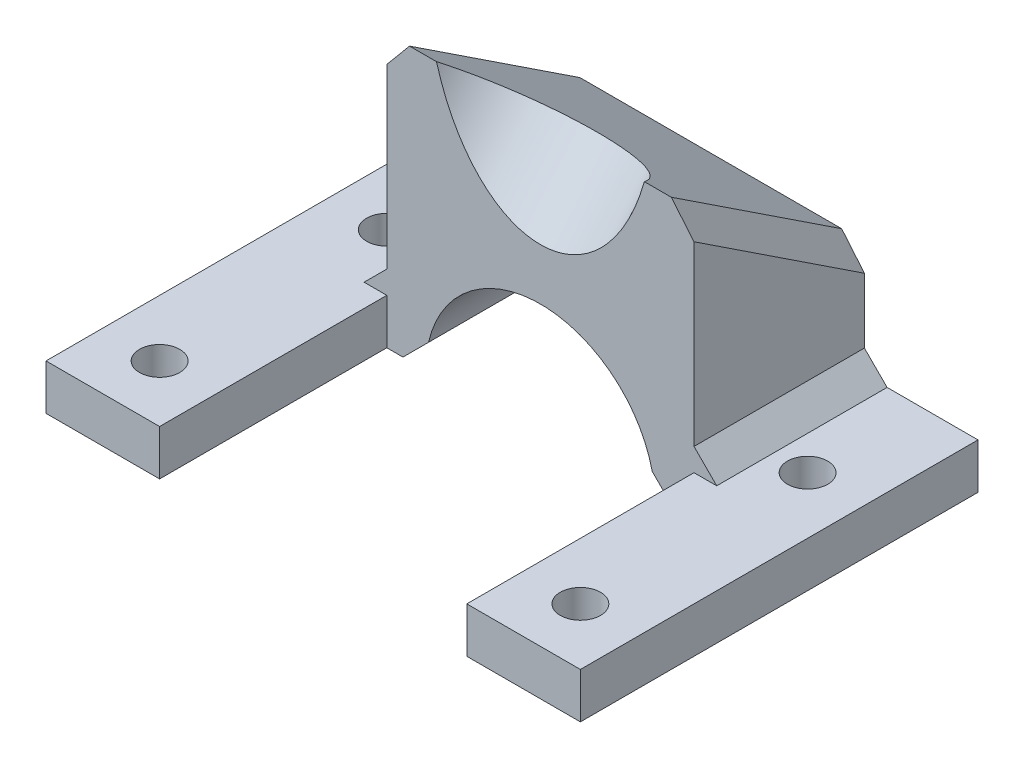
ISO-10303-21;
HEADER;
FILE_DESCRIPTION(('STEP AP214'),'2;1');
FILE_NAME('part.step','',(''),(''),'','','');
FILE_SCHEMA(('AUTOMOTIVE_DESIGN { 1 0 10303 214 1 1 1 1 }'));
ENDSEC;
DATA;
#1=APPLICATION_CONTEXT('core data for automotive mechanical design processes');
#2=APPLICATION_PROTOCOL_DEFINITION('international standard','automotive_design',2000,#1);
#3=PRODUCT_CONTEXT('',#1,'mechanical');
#4=PRODUCT('Part','Part','',(#3));
#5=PRODUCT_RELATED_PRODUCT_CATEGORY('part','',(#4));
#6=PRODUCT_DEFINITION_FORMATION('','',#4);
#7=PRODUCT_DEFINITION_CONTEXT('part definition',#1,'design');
#8=PRODUCT_DEFINITION('design','',#6,#7);
#9=PRODUCT_DEFINITION_SHAPE('','',#8);
#10=(LENGTH_UNIT() NAMED_UNIT(*) SI_UNIT(.MILLI.,.METRE.));
#11=(NAMED_UNIT(*) PLANE_ANGLE_UNIT() SI_UNIT($,.RADIAN.));
#12=(NAMED_UNIT(*) SI_UNIT($,.STERADIAN.) SOLID_ANGLE_UNIT());
#13=UNCERTAINTY_MEASURE_WITH_UNIT(LENGTH_MEASURE(1.E-05),#10,'distance_accuracy_value','');
#14=(GEOMETRIC_REPRESENTATION_CONTEXT(3) GLOBAL_UNCERTAINTY_ASSIGNED_CONTEXT((#13)) GLOBAL_UNIT_ASSIGNED_CONTEXT((#10,
#11,#12)) REPRESENTATION_CONTEXT('',''));
#15=CARTESIAN_POINT('',(0.,0.,0.));
#16=DIRECTION('',(0.,0.,1.));
#17=DIRECTION('',(1.,0.,0.));
#18=AXIS2_PLACEMENT_3D('',#15,#16,#17);
#19=CARTESIAN_POINT('',(0.,0.,50.8));
#20=DIRECTION('',(0.,1.,0.));
#21=DIRECTION('',(0.,0.,1.));
#22=AXIS2_PLACEMENT_3D('',#19,#20,#21);
#23=PLANE('',#22);
#24=CARTESIAN_POINT('',(6.35,0.,12.7));
#25=DIRECTION('',(0.,1.,0.));
#26=DIRECTION('',(0.,0.,1.));
#27=AXIS2_PLACEMENT_3D('',#24,#25,#26);
#28=CIRCLE('',#27,2.25);
#29=CARTESIAN_POINT('',(6.35,0.,14.95));
#30=VERTEX_POINT('',#29);
#31=EDGE_CURVE('E351',#30,#30,#28,.T.);
#32=ORIENTED_EDGE('',*,*,#31,.T.);
#33=EDGE_LOOP('',(#32));
#34=FACE_BOUND('',#33,.T.);
#35=CARTESIAN_POINT('',(6.35,0.,38.1));
#36=DIRECTION('',(0.,1.,0.));
#37=DIRECTION('',(0.,0.,1.));
#38=AXIS2_PLACEMENT_3D('',#35,#36,#37);
#39=CIRCLE('',#38,2.25);
#40=CARTESIAN_POINT('',(6.35,0.,40.35));
#41=VERTEX_POINT('',#40);
#42=EDGE_CURVE('E372',#41,#41,#39,.F.);
#43=ORIENTED_EDGE('',*,*,#42,.F.);
#44=EDGE_LOOP('',(#43));
#45=FACE_BOUND('',#44,.T.);
#46=DIRECTION('',(1.,0.,0.));
#47=VECTOR('',#46,1.);
#48=CARTESIAN_POINT('',(0.,0.,0.));
#49=LINE('',#48,#47);
#50=CARTESIAN_POINT('',(0.,0.,0.));
#51=VERTEX_POINT('',#50);
#52=CARTESIAN_POINT('',(14.5043205374543,0.,0.));
#53=VERTEX_POINT('',#52);
#54=EDGE_CURVE('E350',#51,#53,#49,.T.);
#55=ORIENTED_EDGE('',*,*,#54,.T.);
#56=DIRECTION('',(0.,0.,1.));
#57=VECTOR('',#56,1.);
#58=CARTESIAN_POINT('',(14.5043205374543,0.,19.05));
#59=LINE('',#58,#57);
#60=CARTESIAN_POINT('',(14.5043205374543,0.,19.05));
#61=VERTEX_POINT('',#60);
#62=EDGE_CURVE('E494',#53,#61,#59,.T.);
#63=ORIENTED_EDGE('',*,*,#62,.T.);
#64=DIRECTION('',(1.,0.,0.));
#65=VECTOR('',#64,1.);
#66=CARTESIAN_POINT('',(0.,0.,19.05));
#67=LINE('',#66,#65);
#68=CARTESIAN_POINT('',(12.7,0.,19.05));
#69=VERTEX_POINT('',#68);
#70=EDGE_CURVE('E437',#69,#61,#67,.T.);
#71=ORIENTED_EDGE('',*,*,#70,.F.);
#72=DIRECTION('',(0.,0.,-1.));
#73=VECTOR('',#72,1.);
#74=CARTESIAN_POINT('',(12.7,0.,0.));
#75=LINE('',#74,#73);
#76=CARTESIAN_POINT('',(12.7,0.,44.45));
#77=VERTEX_POINT('',#76);
#78=EDGE_CURVE('E391',#77,#69,#75,.T.);
#79=ORIENTED_EDGE('',*,*,#78,.F.);
#80=DIRECTION('',(1.,0.,0.));
#81=VECTOR('',#80,1.);
#82=CARTESIAN_POINT('',(0.,0.,44.45));
#83=LINE('',#82,#81);
#84=CARTESIAN_POINT('',(0.,0.,44.45));
#85=VERTEX_POINT('',#84);
#86=EDGE_CURVE('E319',#85,#77,#83,.T.);
#87=ORIENTED_EDGE('',*,*,#86,.F.);
#88=DIRECTION('',(0.,0.,-1.));
#89=VECTOR('',#88,1.);
#90=CARTESIAN_POINT('',(0.,0.,50.8));
#91=LINE('',#90,#89);
#92=EDGE_CURVE('E347',#85,#51,#91,.T.);
#93=ORIENTED_EDGE('',*,*,#92,.T.);
#94=EDGE_LOOP('',(#55,#63,#71,#79,#87,#93));
#95=FACE_BOUND('',#94,.T.);
#96=ADVANCED_FACE('F142',(#34,#45,#95),#23,.F.);
#97=CARTESIAN_POINT('',(0.,0.,50.8));
#98=DIRECTION('',(0.,-1.,0.));
#99=DIRECTION('',(0.,0.,-1.));
#100=AXIS2_PLACEMENT_3D('',#97,#98,#99);
#101=PLANE('',#100);
#102=CARTESIAN_POINT('',(53.3926410749086,0.,12.7));
#103=DIRECTION('',(0.,1.,0.));
#104=DIRECTION('',(0.,0.,1.));
#105=AXIS2_PLACEMENT_3D('',#102,#103,#104);
#106=CIRCLE('',#105,2.25);
#107=CARTESIAN_POINT('',(53.3926410749086,0.,14.95));
#108=VERTEX_POINT('',#107);
#109=EDGE_CURVE('E392',#108,#108,#106,.F.);
#110=ORIENTED_EDGE('',*,*,#109,.F.);
#111=EDGE_LOOP('',(#110));
#112=FACE_BOUND('',#111,.T.);
#113=CARTESIAN_POINT('',(53.3926410749086,0.,38.1));
#114=DIRECTION('',(0.,1.,0.));
#115=DIRECTION('',(0.,0.,1.));
#116=AXIS2_PLACEMENT_3D('',#113,#114,#115);
#117=CIRCLE('',#116,2.25);
#118=CARTESIAN_POINT('',(53.3926410749086,0.,40.35));
#119=VERTEX_POINT('',#118);
#120=EDGE_CURVE('E379',#119,#119,#117,.T.);
#121=ORIENTED_EDGE('',*,*,#120,.T.);
#122=EDGE_LOOP('',(#121));
#123=FACE_BOUND('',#122,.T.);
#124=CARTESIAN_POINT('',(45.2383205374543,0.,19.05));
#125=VERTEX_POINT('',#124);
#126=CARTESIAN_POINT('',(47.0426410749086,0.,19.05));
#127=VERTEX_POINT('',#126);
#128=EDGE_CURVE('E431',#125,#127,#67,.T.);
#129=ORIENTED_EDGE('',*,*,#128,.F.);
#130=DIRECTION('',(0.,0.,-1.));
#131=VECTOR('',#130,1.);
#132=CARTESIAN_POINT('',(45.2383205374543,0.,50.8));
#133=LINE('',#132,#131);
#134=CARTESIAN_POINT('',(45.2383205374543,0.,0.));
#135=VERTEX_POINT('',#134);
#136=EDGE_CURVE('E459',#125,#135,#133,.T.);
#137=ORIENTED_EDGE('',*,*,#136,.T.);
#138=DIRECTION('',(-1.,0.,0.));
#139=VECTOR('',#138,1.);
#140=CARTESIAN_POINT('',(0.,0.,0.));
#141=LINE('',#140,#139);
#142=CARTESIAN_POINT('',(59.7426410749086,0.,0.));
#143=VERTEX_POINT('',#142);
#144=EDGE_CURVE('E368',#143,#135,#141,.T.);
#145=ORIENTED_EDGE('',*,*,#144,.F.);
#146=DIRECTION('',(0.,0.,-1.));
#147=VECTOR('',#146,1.);
#148=CARTESIAN_POINT('',(59.7426410749086,0.,50.8));
#149=LINE('',#148,#147);
#150=CARTESIAN_POINT('',(59.7426410749086,0.,44.45));
#151=VERTEX_POINT('',#150);
#152=EDGE_CURVE('E322',#151,#143,#149,.T.);
#153=ORIENTED_EDGE('',*,*,#152,.F.);
#154=DIRECTION('',(1.,0.,0.));
#155=VECTOR('',#154,1.);
#156=CARTESIAN_POINT('',(0.,0.,44.45));
#157=LINE('',#156,#155);
#158=CARTESIAN_POINT('',(47.0426410749086,0.,44.45));
#159=VERTEX_POINT('',#158);
#160=EDGE_CURVE('E414',#159,#151,#157,.T.);
#161=ORIENTED_EDGE('',*,*,#160,.F.);
#162=DIRECTION('',(0.,0.,-1.));
#163=VECTOR('',#162,1.);
#164=CARTESIAN_POINT('',(47.0426410749086,0.,0.));
#165=LINE('',#164,#163);
#166=EDGE_CURVE('E396',#159,#127,#165,.T.);
#167=ORIENTED_EDGE('',*,*,#166,.T.);
#168=EDGE_LOOP('',(#129,#137,#145,#153,#161,#167));
#169=FACE_BOUND('',#168,.T.);
#170=ADVANCED_FACE('F602',(#112,#123,#169),#101,.T.);
#171=CARTESIAN_POINT('',(0.,5.08,50.8));
#172=DIRECTION('',(0.,-1.,0.));
#173=DIRECTION('',(0.,0.,-1.));
#174=AXIS2_PLACEMENT_3D('',#171,#172,#173);
#175=PLANE('',#174);
#176=CARTESIAN_POINT('',(53.3926410749086,5.08,38.1));
#177=DIRECTION('',(0.,1.,0.));
#178=DIRECTION('',(0.,0.,1.));
#179=AXIS2_PLACEMENT_3D('',#176,#177,#178);
#180=CIRCLE('',#179,2.25);
#181=CARTESIAN_POINT('',(53.3926410749086,5.08,40.35));
#182=VERTEX_POINT('',#181);
#183=EDGE_CURVE('E387',#182,#182,#180,.T.);
#184=ORIENTED_EDGE('',*,*,#183,.F.);
#185=EDGE_LOOP('',(#184));
#186=FACE_BOUND('',#185,.T.);
#187=CARTESIAN_POINT('',(53.3926410749086,5.08,12.7));
#188=DIRECTION('',(0.,1.,0.));
#189=DIRECTION('',(0.,0.,1.));
#190=AXIS2_PLACEMENT_3D('',#187,#188,#189);
#191=CIRCLE('',#190,2.25);
#192=CARTESIAN_POINT('',(53.3926410749086,5.08,14.95));
#193=VERTEX_POINT('',#192);
#194=EDGE_CURVE('E331',#193,#193,#191,.F.);
#195=ORIENTED_EDGE('',*,*,#194,.T.);
#196=EDGE_LOOP('',(#195));
#197=FACE_BOUND('',#196,.T.);
#198=DIRECTION('',(-1.,0.,0.));
#199=VECTOR('',#198,1.);
#200=CARTESIAN_POINT('',(0.,5.08,0.));
#201=LINE('',#200,#199);
#202=CARTESIAN_POINT('',(59.7426410749086,5.08,0.));
#203=VERTEX_POINT('',#202);
#204=CARTESIAN_POINT('',(49.5826410749086,5.08,0.));
#205=VERTEX_POINT('',#204);
#206=EDGE_CURVE('E330',#203,#205,#201,.T.);
#207=ORIENTED_EDGE('',*,*,#206,.T.);
#208=DIRECTION('',(0.,0.,1.));
#209=VECTOR('',#208,1.);
#210=CARTESIAN_POINT('',(49.5826410749086,5.08,50.8));
#211=LINE('',#210,#209);
#212=CARTESIAN_POINT('',(49.5826410749086,5.08,19.05));
#213=VERTEX_POINT('',#212);
#214=EDGE_CURVE('E525',#205,#213,#211,.T.);
#215=ORIENTED_EDGE('',*,*,#214,.T.);
#216=DIRECTION('',(-1.,0.,0.));
#217=VECTOR('',#216,1.);
#218=CARTESIAN_POINT('',(0.,5.08,19.05));
#219=LINE('',#218,#217);
#220=CARTESIAN_POINT('',(47.0426410749086,5.07999999999998,19.05));
#221=VERTEX_POINT('',#220);
#222=EDGE_CURVE('E165',#213,#221,#219,.T.);
#223=ORIENTED_EDGE('',*,*,#222,.T.);
#224=DIRECTION('',(0.,0.,-1.));
#225=VECTOR('',#224,1.);
#226=CARTESIAN_POINT('',(47.0426410749086,5.08,50.8));
#227=LINE('',#226,#225);
#228=CARTESIAN_POINT('',(47.0426410749086,5.07999999999998,44.45));
#229=VERTEX_POINT('',#228);
#230=EDGE_CURVE('E332',#229,#221,#227,.T.);
#231=ORIENTED_EDGE('',*,*,#230,.F.);
#232=DIRECTION('',(-1.,0.,0.));
#233=VECTOR('',#232,1.);
#234=CARTESIAN_POINT('',(0.,5.08,44.45));
#235=LINE('',#234,#233);
#236=CARTESIAN_POINT('',(59.7426410749086,5.08,44.45));
#237=VERTEX_POINT('',#236);
#238=EDGE_CURVE('E336',#237,#229,#235,.T.);
#239=ORIENTED_EDGE('',*,*,#238,.F.);
#240=DIRECTION('',(0.,0.,-1.));
#241=VECTOR('',#240,1.);
#242=CARTESIAN_POINT('',(59.7426410749086,5.08,50.8));
#243=LINE('',#242,#241);
#244=EDGE_CURVE('E327',#237,#203,#243,.T.);
#245=ORIENTED_EDGE('',*,*,#244,.T.);
#246=EDGE_LOOP('',(#207,#215,#223,#231,#239,#245));
#247=FACE_BOUND('',#246,.T.);
#248=ADVANCED_FACE('F543',(#186,#197,#247),#175,.F.);
#249=CARTESIAN_POINT('',(0.,5.08,50.8));
#250=DIRECTION('',(0.,1.,0.));
#251=DIRECTION('',(0.,0.,1.));
#252=AXIS2_PLACEMENT_3D('',#249,#250,#251);
#253=PLANE('',#252);
#254=CARTESIAN_POINT('',(6.35,5.08,38.1));
#255=DIRECTION('',(0.,1.,0.));
#256=DIRECTION('',(0.,0.,1.));
#257=AXIS2_PLACEMENT_3D('',#254,#255,#256);
#258=CIRCLE('',#257,2.25);
#259=CARTESIAN_POINT('',(6.35,5.08,40.35));
#260=VERTEX_POINT('',#259);
#261=EDGE_CURVE('E364',#260,#260,#258,.F.);
#262=ORIENTED_EDGE('',*,*,#261,.T.);
#263=EDGE_LOOP('',(#262));
#264=FACE_BOUND('',#263,.T.);
#265=CARTESIAN_POINT('',(6.35,5.08,12.7));
#266=DIRECTION('',(0.,1.,0.));
#267=DIRECTION('',(0.,0.,1.));
#268=AXIS2_PLACEMENT_3D('',#265,#266,#267);
#269=CIRCLE('',#268,2.25);
#270=CARTESIAN_POINT('',(6.35,5.08,14.95));
#271=VERTEX_POINT('',#270);
#272=EDGE_CURVE('E386',#271,#271,#269,.T.);
#273=ORIENTED_EDGE('',*,*,#272,.F.);
#274=EDGE_LOOP('',(#273));
#275=FACE_BOUND('',#274,.T.);
#276=DIRECTION('',(-1.,0.,0.));
#277=VECTOR('',#276,1.);
#278=CARTESIAN_POINT('',(0.,5.08,19.05));
#279=LINE('',#278,#277);
#280=CARTESIAN_POINT('',(12.7,5.07999999999999,19.05));
#281=VERTEX_POINT('',#280);
#282=CARTESIAN_POINT('',(10.16,5.08,19.05));
#283=VERTEX_POINT('',#282);
#284=EDGE_CURVE('E159',#281,#283,#279,.T.);
#285=ORIENTED_EDGE('',*,*,#284,.T.);
#286=DIRECTION('',(0.,0.,-1.));
#287=VECTOR('',#286,1.);
#288=CARTESIAN_POINT('',(10.16,5.08,0.));
#289=LINE('',#288,#287);
#290=CARTESIAN_POINT('',(10.16,5.08,0.));
#291=VERTEX_POINT('',#290);
#292=EDGE_CURVE('E519',#283,#291,#289,.T.);
#293=ORIENTED_EDGE('',*,*,#292,.T.);
#294=DIRECTION('',(1.,0.,0.));
#295=VECTOR('',#294,1.);
#296=CARTESIAN_POINT('',(0.,5.08,0.));
#297=LINE('',#296,#295);
#298=CARTESIAN_POINT('',(0.,5.08,0.));
#299=VERTEX_POINT('',#298);
#300=EDGE_CURVE('E356',#299,#291,#297,.T.);
#301=ORIENTED_EDGE('',*,*,#300,.F.);
#302=DIRECTION('',(0.,0.,-1.));
#303=VECTOR('',#302,1.);
#304=CARTESIAN_POINT('',(0.,5.08,50.8));
#305=LINE('',#304,#303);
#306=CARTESIAN_POINT('',(0.,5.08,44.45));
#307=VERTEX_POINT('',#306);
#308=EDGE_CURVE('E342',#307,#299,#305,.T.);
#309=ORIENTED_EDGE('',*,*,#308,.F.);
#310=DIRECTION('',(1.,0.,0.));
#311=VECTOR('',#310,1.);
#312=CARTESIAN_POINT('',(0.,5.08,44.45));
#313=LINE('',#312,#311);
#314=CARTESIAN_POINT('',(12.7,5.07999999999999,44.45));
#315=VERTEX_POINT('',#314);
#316=EDGE_CURVE('E341',#307,#315,#313,.T.);
#317=ORIENTED_EDGE('',*,*,#316,.T.);
#318=DIRECTION('',(0.,0.,-1.));
#319=VECTOR('',#318,1.);
#320=CARTESIAN_POINT('',(12.7,5.08,50.8));
#321=LINE('',#320,#319);
#322=EDGE_CURVE('E338',#315,#281,#321,.T.);
#323=ORIENTED_EDGE('',*,*,#322,.T.);
#324=EDGE_LOOP('',(#285,#293,#301,#309,#317,#323));
#325=FACE_BOUND('',#324,.T.);
#326=ADVANCED_FACE('F570',(#264,#275,#325),#253,.T.);
#327=CARTESIAN_POINT('',(29.8713205374543,0.,50.8));
#328=DIRECTION('',(0.,0.,-1.));
#329=DIRECTION('',(-1.,0.,0.));
#330=AXIS2_PLACEMENT_3D('',#327,#328,#329);
#331=CYLINDRICAL_SURFACE('',#330,12.827);
#332=CARTESIAN_POINT('',(29.8713205374543,0.,0.));
#333=DIRECTION('',(0.,0.,1.));
#334=DIRECTION('',(1.,0.,0.));
#335=AXIS2_PLACEMENT_3D('',#332,#333,#334);
#336=CIRCLE('',#335,12.827);
#337=CARTESIAN_POINT('',(42.3745500163774,2.86377052107693,0.));
#338=VERTEX_POINT('',#337);
#339=CARTESIAN_POINT('',(17.3680910585312,2.86377052107695,0.));
#340=VERTEX_POINT('',#339);
#341=EDGE_CURVE('E345',#338,#340,#336,.T.);
#342=ORIENTED_EDGE('',*,*,#341,.F.);
#343=DIRECTION('',(0.,0.,-1.));
#344=VECTOR('',#343,1.);
#345=CARTESIAN_POINT('',(42.3745500163774,2.86377052107693,50.8));
#346=LINE('',#345,#344);
#347=CARTESIAN_POINT('',(42.3745500163774,2.86377052107693,19.05));
#348=VERTEX_POINT('',#347);
#349=EDGE_CURVE('E480',#338,#348,#346,.F.);
#350=ORIENTED_EDGE('',*,*,#349,.T.);
#351=CARTESIAN_POINT('',(29.8713205374543,0.,19.05));
#352=DIRECTION('',(0.,0.,1.));
#353=DIRECTION('',(1.,0.,0.));
#354=AXIS2_PLACEMENT_3D('',#351,#352,#353);
#355=CIRCLE('',#354,12.827);
#356=CARTESIAN_POINT('',(17.3680910585312,2.86377052107695,19.05));
#357=VERTEX_POINT('',#356);
#358=EDGE_CURVE('E326',#348,#357,#355,.T.);
#359=ORIENTED_EDGE('',*,*,#358,.T.);
#360=DIRECTION('',(0.,0.,-1.));
#361=VECTOR('',#360,1.);
#362=CARTESIAN_POINT('',(17.3680910585312,2.86377052107695,50.8));
#363=LINE('',#362,#361);
#364=EDGE_CURVE('E476',#357,#340,#363,.T.);
#365=ORIENTED_EDGE('',*,*,#364,.T.);
#366=EDGE_LOOP('',(#342,#350,#359,#365));
#367=FACE_BOUND('',#366,.T.);
#368=ADVANCED_FACE('F593',(#367),#331,.F.);
#369=CARTESIAN_POINT('',(59.7426410749086,0.,50.8));
#370=DIRECTION('',(-1.,0.,0.));
#371=DIRECTION('',(0.,0.,1.));
#372=AXIS2_PLACEMENT_3D('',#369,#370,#371);
#373=PLANE('',#372);
#374=DIRECTION('',(0.,1.,0.));
#375=VECTOR('',#374,1.);
#376=CARTESIAN_POINT('',(59.7426410749086,0.,44.45));
#377=LINE('',#376,#375);
#378=EDGE_CURVE('E421',#151,#237,#377,.T.);
#379=ORIENTED_EDGE('',*,*,#378,.F.);
#380=ORIENTED_EDGE('',*,*,#152,.T.);
#381=DIRECTION('',(0.,1.,0.));
#382=VECTOR('',#381,1.);
#383=CARTESIAN_POINT('',(59.7426410749086,0.,0.));
#384=LINE('',#383,#382);
#385=EDGE_CURVE('E325',#143,#203,#384,.T.);
#386=ORIENTED_EDGE('',*,*,#385,.T.);
#387=ORIENTED_EDGE('',*,*,#244,.F.);
#388=EDGE_LOOP('',(#379,#380,#386,#387));
#389=FACE_BOUND('',#388,.T.);
#390=ADVANCED_FACE('F615',(#389),#373,.F.);
#391=CARTESIAN_POINT('',(0.,0.,50.8));
#392=DIRECTION('',(-1.,0.,0.));
#393=DIRECTION('',(0.,0.,1.));
#394=AXIS2_PLACEMENT_3D('',#391,#392,#393);
#395=PLANE('',#394);
#396=ORIENTED_EDGE('',*,*,#92,.F.);
#397=DIRECTION('',(0.,1.,0.));
#398=VECTOR('',#397,1.);
#399=CARTESIAN_POINT('',(0.,0.,44.45));
#400=LINE('',#399,#398);
#401=EDGE_CURVE('E346',#85,#307,#400,.T.);
#402=ORIENTED_EDGE('',*,*,#401,.T.);
#403=ORIENTED_EDGE('',*,*,#308,.T.);
#404=DIRECTION('',(0.,1.,0.));
#405=VECTOR('',#404,1.);
#406=CARTESIAN_POINT('',(0.,0.,0.));
#407=LINE('',#406,#405);
#408=EDGE_CURVE('E352',#51,#299,#407,.T.);
#409=ORIENTED_EDGE('',*,*,#408,.F.);
#410=EDGE_LOOP('',(#396,#402,#403,#409));
#411=FACE_BOUND('',#410,.T.);
#412=ADVANCED_FACE('F576',(#411),#395,.T.);
#413=CARTESIAN_POINT('',(0.,0.,0.));
#414=DIRECTION('',(0.,0.,1.));
#415=DIRECTION('',(1.,0.,0.));
#416=AXIS2_PLACEMENT_3D('',#413,#414,#415);
#417=PLANE('',#416);
#418=ORIENTED_EDGE('',*,*,#144,.T.);
#419=DIRECTION('',(0.707106781186547,-0.707106781186548,0.));
#420=VECTOR('',#419,1.);
#421=CARTESIAN_POINT('',(45.2383205374543,0.,0.));
#422=LINE('',#421,#420);
#423=EDGE_CURVE('E473',#135,#338,#422,.F.);
#424=ORIENTED_EDGE('',*,*,#423,.T.);
#425=ORIENTED_EDGE('',*,*,#341,.T.);
#426=DIRECTION('',(0.707106781186548,0.707106781186547,0.));
#427=VECTOR('',#426,1.);
#428=CARTESIAN_POINT('',(17.3680910585312,2.86377052107695,0.));
#429=LINE('',#428,#427);
#430=EDGE_CURVE('E470',#340,#53,#429,.F.);
#431=ORIENTED_EDGE('',*,*,#430,.T.);
#432=ORIENTED_EDGE('',*,*,#54,.F.);
#433=ORIENTED_EDGE('',*,*,#408,.T.);
#434=ORIENTED_EDGE('',*,*,#300,.T.);
#435=DIRECTION('',(-0.707106781186551,-0.707106781186544,0.));
#436=VECTOR('',#435,1.);
#437=CARTESIAN_POINT('',(2.53999999999993,-2.53999999999996,0.));
#438=LINE('',#437,#436);
#439=CARTESIAN_POINT('',(12.7,7.61999999999999,0.));
#440=VERTEX_POINT('',#439);
#441=EDGE_CURVE('E528',#291,#440,#438,.F.);
#442=ORIENTED_EDGE('',*,*,#441,.T.);
#443=DIRECTION('',(0.,-1.,0.));
#444=VECTOR('',#443,1.);
#445=CARTESIAN_POINT('',(12.7,0.,0.));
#446=LINE('',#445,#444);
#447=CARTESIAN_POINT('',(12.7,14.8636602292876,0.));
#448=VERTEX_POINT('',#447);
#449=EDGE_CURVE('E456',#448,#440,#446,.T.);
#450=ORIENTED_EDGE('',*,*,#449,.F.);
#451=DIRECTION('',(-0.64076239694201,-0.767739246531744,0.));
#452=VECTOR('',#451,1.);
#453=CARTESIAN_POINT('',(10.4813389964601,12.2053376821215,0.));
#454=LINE('',#453,#452);
#455=CARTESIAN_POINT('',(15.24,17.907,0.));
#456=VERTEX_POINT('',#455);
#457=EDGE_CURVE('E464',#448,#456,#454,.F.);
#458=ORIENTED_EDGE('',*,*,#457,.T.);
#459=DIRECTION('',(-1.,0.,0.));
#460=VECTOR('',#459,1.);
#461=CARTESIAN_POINT('',(78.7926410749086,17.907,0.));
#462=LINE('',#461,#460);
#463=CARTESIAN_POINT('',(44.5026410749086,17.907,0.));
#464=VERTEX_POINT('',#463);
#465=EDGE_CURVE('E310',#464,#456,#462,.T.);
#466=ORIENTED_EDGE('',*,*,#465,.F.);
#467=DIRECTION('',(-0.640762396942005,0.767739246531748,0.));
#468=VECTOR('',#467,1.);
#469=CARTESIAN_POINT('',(47.1755737158274,14.7043849564789,0.));
#470=LINE('',#469,#468);
#471=CARTESIAN_POINT('',(47.0426410749086,14.8636602292876,0.));
#472=VERTEX_POINT('',#471);
#473=EDGE_CURVE('E467',#464,#472,#470,.F.);
#474=ORIENTED_EDGE('',*,*,#473,.T.);
#475=DIRECTION('',(0.,-1.,0.));
#476=VECTOR('',#475,1.);
#477=CARTESIAN_POINT('',(47.0426410749086,0.,0.));
#478=LINE('',#477,#476);
#479=CARTESIAN_POINT('',(47.0426410749086,7.62000000000002,0.));
#480=VERTEX_POINT('',#479);
#481=EDGE_CURVE('E360',#472,#480,#478,.T.);
#482=ORIENTED_EDGE('',*,*,#481,.T.);
#483=DIRECTION('',(0.707106781186544,-0.707106781186551,0.));
#484=VECTOR('',#483,1.);
#485=CARTESIAN_POINT('',(27.3313205374546,27.3313205374543,0.));
#486=LINE('',#485,#484);
#487=EDGE_CURVE('E152',#480,#205,#486,.T.);
#488=ORIENTED_EDGE('',*,*,#487,.T.);
#489=ORIENTED_EDGE('',*,*,#206,.F.);
#490=ORIENTED_EDGE('',*,*,#385,.F.);
#491=EDGE_LOOP('',(#418,#424,#425,#431,#432,#433,#434,#442,#450,#458,#466,#474,#482,#488,#489,#490));
#492=FACE_BOUND('',#491,.T.);
#493=ADVANCED_FACE('F536',(#492),#417,.F.);
#494=CARTESIAN_POINT('',(6.35,0.,38.1));
#495=DIRECTION('',(0.,1.,0.));
#496=DIRECTION('',(0.,0.,1.));
#497=AXIS2_PLACEMENT_3D('',#494,#495,#496);
#498=CYLINDRICAL_SURFACE('',#497,2.25);
#499=ORIENTED_EDGE('',*,*,#42,.T.);
#500=EDGE_LOOP('',(#499));
#501=FACE_BOUND('',#500,.T.);
#502=ORIENTED_EDGE('',*,*,#261,.F.);
#503=EDGE_LOOP('',(#502));
#504=FACE_BOUND('',#503,.T.);
#505=ADVANCED_FACE('F650',(#501,#504),#498,.F.);
#506=CARTESIAN_POINT('',(6.35,0.,12.7));
#507=DIRECTION('',(0.,1.,0.));
#508=DIRECTION('',(0.,0.,1.));
#509=AXIS2_PLACEMENT_3D('',#506,#507,#508);
#510=CYLINDRICAL_SURFACE('',#509,2.25);
#511=ORIENTED_EDGE('',*,*,#31,.F.);
#512=EDGE_LOOP('',(#511));
#513=FACE_BOUND('',#512,.T.);
#514=ORIENTED_EDGE('',*,*,#272,.T.);
#515=EDGE_LOOP('',(#514));
#516=FACE_BOUND('',#515,.T.);
#517=ADVANCED_FACE('F653',(#513,#516),#510,.F.);
#518=CARTESIAN_POINT('',(53.3926410749086,0.,12.7));
#519=DIRECTION('',(0.,1.,0.));
#520=DIRECTION('',(0.,0.,1.));
#521=AXIS2_PLACEMENT_3D('',#518,#519,#520);
#522=CYLINDRICAL_SURFACE('',#521,2.25);
#523=ORIENTED_EDGE('',*,*,#109,.T.);
#524=EDGE_LOOP('',(#523));
#525=FACE_BOUND('',#524,.T.);
#526=ORIENTED_EDGE('',*,*,#194,.F.);
#527=EDGE_LOOP('',(#526));
#528=FACE_BOUND('',#527,.T.);
#529=ADVANCED_FACE('F658',(#525,#528),#522,.F.);
#530=CARTESIAN_POINT('',(53.3926410749086,0.,38.1));
#531=DIRECTION('',(0.,1.,0.));
#532=DIRECTION('',(0.,0.,1.));
#533=AXIS2_PLACEMENT_3D('',#530,#531,#532);
#534=CYLINDRICAL_SURFACE('',#533,2.25);
#535=ORIENTED_EDGE('',*,*,#120,.F.);
#536=EDGE_LOOP('',(#535));
#537=FACE_BOUND('',#536,.T.);
#538=ORIENTED_EDGE('',*,*,#183,.T.);
#539=EDGE_LOOP('',(#538));
#540=FACE_BOUND('',#539,.T.);
#541=ADVANCED_FACE('F655',(#537,#540),#534,.F.);
#542=CARTESIAN_POINT('',(12.7,0.,0.));
#543=DIRECTION('',(1.,0.,0.));
#544=DIRECTION('',(0.,0.,-1.));
#545=AXIS2_PLACEMENT_3D('',#542,#543,#544);
#546=PLANE('',#545);
#547=ORIENTED_EDGE('',*,*,#322,.F.);
#548=DIRECTION('',(0.,1.,0.));
#549=VECTOR('',#548,1.);
#550=CARTESIAN_POINT('',(12.7,0.,44.45));
#551=LINE('',#550,#549);
#552=EDGE_CURVE('E311',#77,#315,#551,.T.);
#553=ORIENTED_EDGE('',*,*,#552,.F.);
#554=ORIENTED_EDGE('',*,*,#78,.T.);
#555=DIRECTION('',(0.,1.,0.));
#556=VECTOR('',#555,1.);
#557=CARTESIAN_POINT('',(12.7,0.,19.05));
#558=LINE('',#557,#556);
#559=EDGE_CURVE('E300',#69,#281,#558,.T.);
#560=ORIENTED_EDGE('',*,*,#559,.T.);
#561=EDGE_LOOP('',(#547,#553,#554,#560));
#562=FACE_BOUND('',#561,.T.);
#563=ADVANCED_FACE('F583',(#562),#546,.T.);
#564=CARTESIAN_POINT('',(0.,0.,19.05));
#565=DIRECTION('',(0.,0.,1.));
#566=DIRECTION('',(1.,0.,0.));
#567=AXIS2_PLACEMENT_3D('',#564,#565,#566);
#568=PLANE('',#567);
#569=ORIENTED_EDGE('',*,*,#358,.F.);
#570=DIRECTION('',(-0.707106781186547,0.707106781186548,0.));
#571=VECTOR('',#570,1.);
#572=CARTESIAN_POINT('',(22.6191602687272,22.6191602687271,19.05));
#573=LINE('',#572,#571);
#574=EDGE_CURVE('E491',#348,#125,#573,.F.);
#575=ORIENTED_EDGE('',*,*,#574,.T.);
#576=ORIENTED_EDGE('',*,*,#128,.T.);
#577=DIRECTION('',(0.,1.,0.));
#578=VECTOR('',#577,1.);
#579=CARTESIAN_POINT('',(47.0426410749086,0.,19.05));
#580=LINE('',#579,#578);
#581=EDGE_CURVE('E428',#127,#221,#580,.T.);
#582=ORIENTED_EDGE('',*,*,#581,.T.);
#583=ORIENTED_EDGE('',*,*,#222,.F.);
#584=DIRECTION('',(-0.707106781186544,0.707106781186551,0.));
#585=VECTOR('',#584,1.);
#586=CARTESIAN_POINT('',(47.0426410749086,7.62000000000002,19.05));
#587=LINE('',#586,#585);
#588=CARTESIAN_POINT('',(47.0426410749086,7.62000000000002,19.05));
#589=VERTEX_POINT('',#588);
#590=EDGE_CURVE('E12',#213,#589,#587,.T.);
#591=ORIENTED_EDGE('',*,*,#590,.T.);
#592=DIRECTION('',(0.,1.,0.));
#593=VECTOR('',#592,1.);
#594=CARTESIAN_POINT('',(47.0426410749086,0.,19.05));
#595=LINE('',#594,#593);
#596=CARTESIAN_POINT('',(47.0426410749086,27.4366602292875,19.05));
#597=VERTEX_POINT('',#596);
#598=EDGE_CURVE('E427',#589,#597,#595,.T.);
#599=ORIENTED_EDGE('',*,*,#598,.T.);
#600=DIRECTION('',(0.640762396942005,-0.767739246531748,0.));
#601=VECTOR('',#600,1.);
#602=CARTESIAN_POINT('',(41.2251883624931,34.4069299946156,19.05));
#603=LINE('',#602,#601);
#604=CARTESIAN_POINT('',(44.5026410749086,30.48,19.05));
#605=VERTEX_POINT('',#604);
#606=EDGE_CURVE('E294',#597,#605,#603,.F.);
#607=ORIENTED_EDGE('',*,*,#606,.T.);
#608=DIRECTION('',(-1.,0.,0.));
#609=VECTOR('',#608,1.);
#610=CARTESIAN_POINT('',(78.7926410749086,30.48,19.05));
#611=LINE('',#610,#609);
#612=CARTESIAN_POINT('',(41.4880405440423,30.48,19.05));
#613=VERTEX_POINT('',#612);
#614=EDGE_CURVE('E285',#605,#613,#611,.T.);
#615=ORIENTED_EDGE('',*,*,#614,.T.);
#616=CARTESIAN_POINT('',(29.8713205374543,38.553571428553,19.05));
#617=DIRECTION('',(0.,0.,1.));
#618=DIRECTION('',(0.,1.,0.));
#619=AXIS2_PLACEMENT_3D('',#616,#617,#618);
#620=ELLIPSE('',#619,19.9777491020303,12.7);
#621=CARTESIAN_POINT('',(18.2546005308664,30.48,19.05));
#622=VERTEX_POINT('',#621);
#623=EDGE_CURVE('E290',#613,#622,#620,.F.);
#624=ORIENTED_EDGE('',*,*,#623,.T.);
#625=CARTESIAN_POINT('',(15.24,30.48,19.05));
#626=VERTEX_POINT('',#625);
#627=EDGE_CURVE('E302',#622,#626,#611,.T.);
#628=ORIENTED_EDGE('',*,*,#627,.T.);
#629=DIRECTION('',(0.64076239694201,0.767739246531744,0.));
#630=VECTOR('',#629,1.);
#631=CARTESIAN_POINT('',(-6.01146873400777,5.01722835265462,19.05));
#632=LINE('',#631,#630);
#633=CARTESIAN_POINT('',(12.7,27.4366602292876,19.05));
#634=VERTEX_POINT('',#633);
#635=EDGE_CURVE('E483',#626,#634,#632,.F.);
#636=ORIENTED_EDGE('',*,*,#635,.T.);
#637=DIRECTION('',(0.,1.,0.));
#638=VECTOR('',#637,1.);
#639=CARTESIAN_POINT('',(12.7,0.,19.05));
#640=LINE('',#639,#638);
#641=CARTESIAN_POINT('',(12.7,7.61999999999999,19.05));
#642=VERTEX_POINT('',#641);
#643=EDGE_CURVE('E316',#642,#634,#640,.T.);
#644=ORIENTED_EDGE('',*,*,#643,.F.);
#645=DIRECTION('',(0.707106781186551,0.707106781186544,0.));
#646=VECTOR('',#645,1.);
#647=CARTESIAN_POINT('',(10.16,5.08,19.05));
#648=LINE('',#647,#646);
#649=EDGE_CURVE('E531',#642,#283,#648,.F.);
#650=ORIENTED_EDGE('',*,*,#649,.T.);
#651=ORIENTED_EDGE('',*,*,#284,.F.);
#652=ORIENTED_EDGE('',*,*,#559,.F.);
#653=ORIENTED_EDGE('',*,*,#70,.T.);
#654=DIRECTION('',(-0.707106781186548,-0.707106781186547,0.));
#655=VECTOR('',#654,1.);
#656=CARTESIAN_POINT('',(7.25216026872713,-7.25216026872714,19.05));
#657=LINE('',#656,#655);
#658=EDGE_CURVE('E488',#61,#357,#657,.F.);
#659=ORIENTED_EDGE('',*,*,#658,.T.);
#660=EDGE_LOOP('',(#569,#575,#576,#582,#583,#591,#599,#607,#615,#624,#628,#636,#644,#650,#651,
#652,#653,#659));
#661=FACE_BOUND('',#660,.T.);
#662=ADVANCED_FACE('F288',(#661),#568,.T.);
#663=CARTESIAN_POINT('',(47.0426410749086,0.,0.));
#664=DIRECTION('',(1.,0.,0.));
#665=DIRECTION('',(0.,0.,-1.));
#666=AXIS2_PLACEMENT_3D('',#663,#664,#665);
#667=PLANE('',#666);
#668=ORIENTED_EDGE('',*,*,#581,.F.);
#669=ORIENTED_EDGE('',*,*,#166,.F.);
#670=DIRECTION('',(0.,1.,0.));
#671=VECTOR('',#670,1.);
#672=CARTESIAN_POINT('',(47.0426410749086,0.,44.45));
#673=LINE('',#672,#671);
#674=EDGE_CURVE('E337',#159,#229,#673,.T.);
#675=ORIENTED_EDGE('',*,*,#674,.T.);
#676=ORIENTED_EDGE('',*,*,#230,.T.);
#677=EDGE_LOOP('',(#668,#669,#675,#676));
#678=FACE_BOUND('',#677,.T.);
#679=ADVANCED_FACE('F610',(#678),#667,.F.);
#680=CARTESIAN_POINT('',(0.,0.,44.45));
#681=DIRECTION('',(0.,0.,1.));
#682=DIRECTION('',(1.,0.,0.));
#683=AXIS2_PLACEMENT_3D('',#680,#681,#682);
#684=PLANE('',#683);
#685=ORIENTED_EDGE('',*,*,#238,.T.);
#686=ORIENTED_EDGE('',*,*,#674,.F.);
#687=ORIENTED_EDGE('',*,*,#160,.T.);
#688=ORIENTED_EDGE('',*,*,#378,.T.);
#689=EDGE_LOOP('',(#685,#686,#687,#688));
#690=FACE_BOUND('',#689,.T.);
#691=ADVANCED_FACE('F616',(#690),#684,.T.);
#692=CARTESIAN_POINT('',(0.,0.,44.45));
#693=DIRECTION('',(0.,0.,1.));
#694=DIRECTION('',(1.,0.,0.));
#695=AXIS2_PLACEMENT_3D('',#692,#693,#694);
#696=PLANE('',#695);
#697=ORIENTED_EDGE('',*,*,#401,.F.);
#698=ORIENTED_EDGE('',*,*,#86,.T.);
#699=ORIENTED_EDGE('',*,*,#552,.T.);
#700=ORIENTED_EDGE('',*,*,#316,.F.);
#701=EDGE_LOOP('',(#697,#698,#699,#700));
#702=FACE_BOUND('',#701,.T.);
#703=ADVANCED_FACE('F578',(#702),#696,.T.);
#704=CARTESIAN_POINT('',(78.7926410749086,12.4735302312622,-8.23252995263305));
#705=DIRECTION('',(0.,0.834609406561725,-0.550842208330739));
#706=DIRECTION('',(0.,0.550842208330739,0.834609406561725));
#707=AXIS2_PLACEMENT_3D('',#704,#705,#706);
#708=PLANE('',#707);
#709=ORIENTED_EDGE('',*,*,#614,.F.);
#710=DIRECTION('',(0.,-0.550842208330739,-0.834609406561725));
#711=VECTOR('',#710,1.);
#712=CARTESIAN_POINT('',(44.5026410749086,12.4735302312622,-8.23252995263305));
#713=LINE('',#712,#711);
#714=EDGE_CURVE('E500',#605,#464,#713,.T.);
#715=ORIENTED_EDGE('',*,*,#714,.T.);
#716=ORIENTED_EDGE('',*,*,#465,.T.);
#717=DIRECTION('',(0.,0.550842208330739,0.834609406561725));
#718=VECTOR('',#717,1.);
#719=CARTESIAN_POINT('',(15.24,12.4735302312622,-8.23252995263305));
#720=LINE('',#719,#718);
#721=EDGE_CURVE('E497',#456,#626,#720,.T.);
#722=ORIENTED_EDGE('',*,*,#721,.T.);
#723=ORIENTED_EDGE('',*,*,#627,.F.);
#724=CARTESIAN_POINT('',(29.8713205374543,33.3229801829203,23.3575457316975));
#725=DIRECTION('',(0.,0.834609406561725,-0.550842208330739));
#726=DIRECTION('',(0.,-0.550842208330739,-0.834609406561725));
#727=AXIS2_PLACEMENT_3D('',#724,#725,#726);
#728=ELLIPSE('',#727,12.7710758534384,12.7);
#729=EDGE_CURVE('E305',#622,#613,#728,.F.);
#730=ORIENTED_EDGE('',*,*,#729,.T.);
#731=EDGE_LOOP('',(#709,#715,#716,#722,#723,#730));
#732=FACE_BOUND('',#731,.T.);
#733=ADVANCED_FACE('F308',(#732),#708,.T.);
#734=CARTESIAN_POINT('',(12.7,0.,0.));
#735=DIRECTION('',(-1.,0.,0.));
#736=DIRECTION('',(0.,0.,1.));
#737=AXIS2_PLACEMENT_3D('',#734,#735,#736);
#738=PLANE('',#737);
#739=ORIENTED_EDGE('',*,*,#643,.T.);
#740=DIRECTION('',(0.,-0.550842208330739,-0.834609406561725));
#741=VECTOR('',#740,1.);
#742=CARTESIAN_POINT('',(12.7,10.3536223385954,-6.83339074347297));
#743=LINE('',#742,#741);
#744=EDGE_CURVE('E513',#634,#448,#743,.T.);
#745=ORIENTED_EDGE('',*,*,#744,.T.);
#746=ORIENTED_EDGE('',*,*,#449,.T.);
#747=DIRECTION('',(0.,0.,1.));
#748=VECTOR('',#747,1.);
#749=CARTESIAN_POINT('',(12.7,7.61999999999999,19.05));
#750=LINE('',#749,#748);
#751=EDGE_CURVE('E510',#440,#642,#750,.T.);
#752=ORIENTED_EDGE('',*,*,#751,.T.);
#753=EDGE_LOOP('',(#739,#745,#746,#752));
#754=FACE_BOUND('',#753,.T.);
#755=ADVANCED_FACE('F561',(#754),#738,.T.);
#756=CARTESIAN_POINT('',(47.0426410749086,0.,0.));
#757=DIRECTION('',(1.,0.,0.));
#758=DIRECTION('',(0.,0.,-1.));
#759=AXIS2_PLACEMENT_3D('',#756,#757,#758);
#760=PLANE('',#759);
#761=ORIENTED_EDGE('',*,*,#481,.F.);
#762=DIRECTION('',(0.,0.550842208330739,0.834609406561725));
#763=VECTOR('',#762,1.);
#764=CARTESIAN_POINT('',(47.0426410749086,10.3536223385954,-6.83339074347296));
#765=LINE('',#764,#763);
#766=EDGE_CURVE('E507',#472,#597,#765,.T.);
#767=ORIENTED_EDGE('',*,*,#766,.T.);
#768=ORIENTED_EDGE('',*,*,#598,.F.);
#769=DIRECTION('',(0.,0.,-1.));
#770=VECTOR('',#769,1.);
#771=CARTESIAN_POINT('',(47.0426410749086,7.62000000000002,0.));
#772=LINE('',#771,#770);
#773=EDGE_CURVE('E503',#589,#480,#772,.T.);
#774=ORIENTED_EDGE('',*,*,#773,.T.);
#775=EDGE_LOOP('',(#761,#767,#768,#774));
#776=FACE_BOUND('',#775,.T.);
#777=ADVANCED_FACE('F549',(#776),#760,.T.);
#778=CARTESIAN_POINT('',(29.8713205374544,0.,50.7999999999848));
#779=DIRECTION('',(0.,0.77193023561705,-0.6357072528611));
#780=DIRECTION('',(0.,0.6357072528611,0.77193023561705));
#781=AXIS2_PLACEMENT_3D('',#778,#779,#780);
#782=CYLINDRICAL_SURFACE('',#781,12.7);
#783=ORIENTED_EDGE('',*,*,#729,.F.);
#784=ORIENTED_EDGE('',*,*,#623,.F.);
#785=EDGE_LOOP('',(#783,#784));
#786=FACE_BOUND('',#785,.T.);
#787=ADVANCED_FACE('F304',(#786),#782,.F.);
#788=CARTESIAN_POINT('',(45.2383205374543,0.,50.8));
#789=DIRECTION('',(0.707106781186548,0.707106781186547,0.));
#790=DIRECTION('',(0.,0.,-1.));
#791=AXIS2_PLACEMENT_3D('',#788,#789,#790);
#792=PLANE('',#791);
#793=ORIENTED_EDGE('',*,*,#574,.F.);
#794=ORIENTED_EDGE('',*,*,#349,.F.);
#795=ORIENTED_EDGE('',*,*,#423,.F.);
#796=ORIENTED_EDGE('',*,*,#136,.F.);
#797=EDGE_LOOP('',(#793,#794,#795,#796));
#798=FACE_BOUND('',#797,.T.);
#799=ADVANCED_FACE('F599',(#798),#792,.F.);
#800=CARTESIAN_POINT('',(17.3680910585312,2.86377052107695,50.8));
#801=DIRECTION('',(-0.707106781186547,0.707106781186548,0.));
#802=DIRECTION('',(0.,0.,-1.));
#803=AXIS2_PLACEMENT_3D('',#800,#801,#802);
#804=PLANE('',#803);
#805=ORIENTED_EDGE('',*,*,#658,.F.);
#806=ORIENTED_EDGE('',*,*,#62,.F.);
#807=ORIENTED_EDGE('',*,*,#430,.F.);
#808=ORIENTED_EDGE('',*,*,#364,.F.);
#809=EDGE_LOOP('',(#805,#806,#807,#808));
#810=FACE_BOUND('',#809,.T.);
#811=ADVANCED_FACE('F590',(#810),#804,.F.);
#812=CARTESIAN_POINT('',(44.5026410749086,12.4735302312622,-8.23252995263305));
#813=DIRECTION('',(-0.707106781186549,-0.590157971021875,0.389504260874437));
#814=DIRECTION('',(0.,-0.550842208330739,-0.834609406561725));
#815=AXIS2_PLACEMENT_3D('',#812,#813,#814);
#816=PLANE('',#815);
#817=ORIENTED_EDGE('',*,*,#606,.F.);
#818=ORIENTED_EDGE('',*,*,#766,.F.);
#819=ORIENTED_EDGE('',*,*,#473,.F.);
#820=ORIENTED_EDGE('',*,*,#714,.F.);
#821=EDGE_LOOP('',(#817,#818,#819,#820));
#822=FACE_BOUND('',#821,.T.);
#823=ADVANCED_FACE('F552',(#822),#816,.F.);
#824=CARTESIAN_POINT('',(12.7,10.3536223385954,-6.83339074347297));
#825=DIRECTION('',(0.707106781186545,-0.590157971021878,0.38950426087444));
#826=DIRECTION('',(0.,-0.550842208330739,-0.834609406561725));
#827=AXIS2_PLACEMENT_3D('',#824,#825,#826);
#828=PLANE('',#827);
#829=ORIENTED_EDGE('',*,*,#635,.F.);
#830=ORIENTED_EDGE('',*,*,#721,.F.);
#831=ORIENTED_EDGE('',*,*,#457,.F.);
#832=ORIENTED_EDGE('',*,*,#744,.F.);
#833=EDGE_LOOP('',(#829,#830,#831,#832));
#834=FACE_BOUND('',#833,.T.);
#835=ADVANCED_FACE('F559',(#834),#828,.F.);
#836=CARTESIAN_POINT('',(10.16,5.08,50.8));
#837=DIRECTION('',(-0.707106781186544,0.707106781186551,0.));
#838=DIRECTION('',(0.,0.,1.));
#839=AXIS2_PLACEMENT_3D('',#836,#837,#838);
#840=PLANE('',#839);
#841=ORIENTED_EDGE('',*,*,#649,.F.);
#842=ORIENTED_EDGE('',*,*,#751,.F.);
#843=ORIENTED_EDGE('',*,*,#441,.F.);
#844=ORIENTED_EDGE('',*,*,#292,.F.);
#845=EDGE_LOOP('',(#841,#842,#843,#844));
#846=FACE_BOUND('',#845,.T.);
#847=ADVANCED_FACE('F567',(#846),#840,.T.);
#848=CARTESIAN_POINT('',(47.0426410749086,7.62000000000002,0.));
#849=DIRECTION('',(-0.707106781186551,-0.707106781186544,0.));
#850=DIRECTION('',(0.,0.,-1.));
#851=AXIS2_PLACEMENT_3D('',#848,#849,#850);
#852=PLANE('',#851);
#853=ORIENTED_EDGE('',*,*,#590,.F.);
#854=ORIENTED_EDGE('',*,*,#214,.F.);
#855=ORIENTED_EDGE('',*,*,#487,.F.);
#856=ORIENTED_EDGE('',*,*,#773,.F.);
#857=EDGE_LOOP('',(#853,#854,#855,#856));
#858=FACE_BOUND('',#857,.T.);
#859=ADVANCED_FACE('F145',(#858),#852,.F.);
#860=CLOSED_SHELL('',(#96,#170,#248,#326,#368,#390,#412,#493,#505,#517,#529,#541,#563,#662,#679,
#691,#703,#733,#755,#777,#787,#799,#811,#823,#835,#847,#859));
#861=MANIFOLD_SOLID_BREP('B2',#860);
#862=ADVANCED_BREP_SHAPE_REPRESENTATION('',(#18,#861),#14);
#863=SHAPE_DEFINITION_REPRESENTATION(#9,#862);
ENDSEC;
END-ISO-10303-21;
